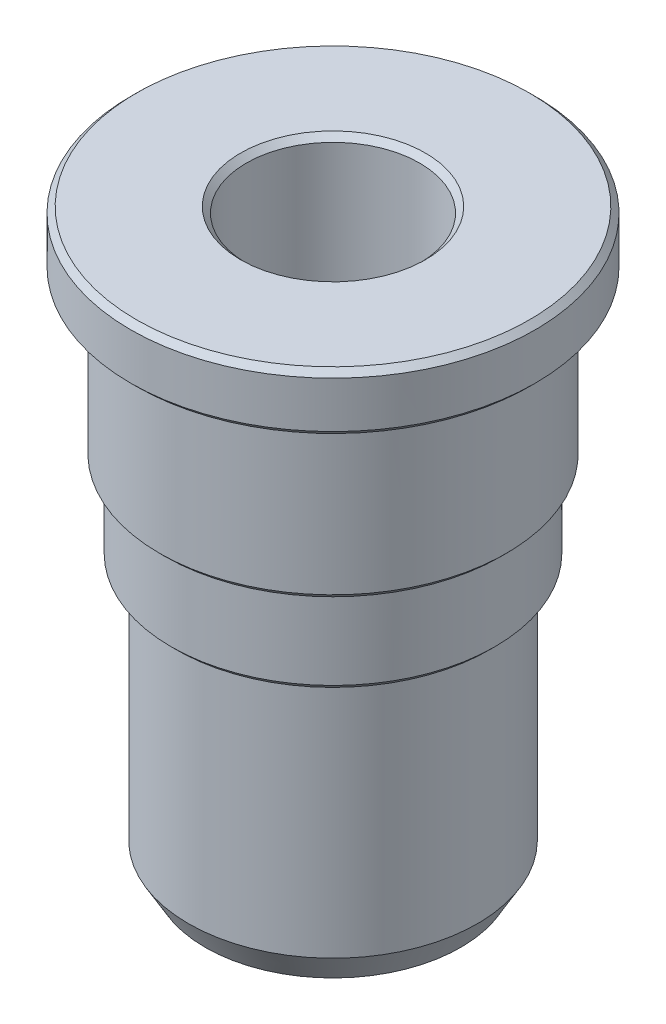
ISO-10303-21;
HEADER;
FILE_DESCRIPTION(('STEP AP214'),'2;1');
FILE_NAME('part.step','',(''),(''),'','','');
FILE_SCHEMA(('AUTOMOTIVE_DESIGN { 1 0 10303 214 1 1 1 1 }'));
ENDSEC;
DATA;
#1=APPLICATION_CONTEXT('core data for automotive mechanical design processes');
#2=APPLICATION_PROTOCOL_DEFINITION('international standard','automotive_design',2000,#1);
#3=PRODUCT_CONTEXT('',#1,'mechanical');
#4=PRODUCT('Part','Part','',(#3));
#5=PRODUCT_RELATED_PRODUCT_CATEGORY('part','',(#4));
#6=PRODUCT_DEFINITION_FORMATION('','',#4);
#7=PRODUCT_DEFINITION_CONTEXT('part definition',#1,'design');
#8=PRODUCT_DEFINITION('design','',#6,#7);
#9=PRODUCT_DEFINITION_SHAPE('','',#8);
#10=(LENGTH_UNIT() NAMED_UNIT(*) SI_UNIT(.MILLI.,.METRE.));
#11=(NAMED_UNIT(*) PLANE_ANGLE_UNIT() SI_UNIT($,.RADIAN.));
#12=(NAMED_UNIT(*) SI_UNIT($,.STERADIAN.) SOLID_ANGLE_UNIT());
#13=UNCERTAINTY_MEASURE_WITH_UNIT(LENGTH_MEASURE(1.E-05),#10,'distance_accuracy_value','');
#14=(GEOMETRIC_REPRESENTATION_CONTEXT(3) GLOBAL_UNCERTAINTY_ASSIGNED_CONTEXT((#13)) GLOBAL_UNIT_ASSIGNED_CONTEXT((#10,
#11,#12)) REPRESENTATION_CONTEXT('',''));
#15=CARTESIAN_POINT('',(0.,0.,0.));
#16=DIRECTION('',(0.,0.,1.));
#17=DIRECTION('',(1.,0.,0.));
#18=AXIS2_PLACEMENT_3D('',#15,#16,#17);
#19=CARTESIAN_POINT('',(-22.1132486540518,-70.0980202949079,0.));
#20=DIRECTION('',(0.,-1.,0.));
#21=DIRECTION('',(0.,0.,-1.));
#22=AXIS2_PLACEMENT_3D('',#19,#20,#21);
#23=PLANE('',#22);
#24=CARTESIAN_POINT('',(0.,-70.0980202949079,0.));
#25=DIRECTION('',(0.,-1.,0.));
#26=DIRECTION('',(0.,0.,-1.));
#27=AXIS2_PLACEMENT_3D('',#24,#25,#26);
#28=CIRCLE('',#27,16.);
#29=CARTESIAN_POINT('',(0.,-70.0980202949079,-16.));
#30=VERTEX_POINT('',#29);
#31=EDGE_CURVE('E10',#30,#30,#28,.F.);
#32=ORIENTED_EDGE('',*,*,#31,.T.);
#33=EDGE_LOOP('',(#32));
#34=FACE_BOUND('',#33,.T.);
#35=CARTESIAN_POINT('',(0.,-70.0980202949079,0.));
#36=DIRECTION('',(0.,1.,0.));
#37=DIRECTION('',(0.,0.,1.));
#38=AXIS2_PLACEMENT_3D('',#35,#36,#37);
#39=CIRCLE('',#38,22.1132486540518);
#40=CARTESIAN_POINT('',(0.,-70.0980202949079,22.1132486540518));
#41=VERTEX_POINT('',#40);
#42=EDGE_CURVE('E86',#41,#41,#39,.T.);
#43=ORIENTED_EDGE('',*,*,#42,.F.);
#44=EDGE_LOOP('',(#43));
#45=FACE_BOUND('',#44,.T.);
#46=ADVANCED_FACE('F30',(#34,#45),#23,.T.);
#47=CARTESIAN_POINT('',(0.,34.9453525641026,0.));
#48=DIRECTION('',(0.,1.,0.));
#49=DIRECTION('',(0.,0.,1.));
#50=AXIS2_PLACEMENT_3D('',#47,#48,#49);
#51=CYLINDRICAL_SURFACE('',#50,15.);
#52=CARTESIAN_POINT('',(0.,28.9019797050922,0.));
#53=DIRECTION('',(0.,1.,0.));
#54=DIRECTION('',(0.,0.,1.));
#55=AXIS2_PLACEMENT_3D('',#52,#53,#54);
#56=CIRCLE('',#55,15.);
#57=CARTESIAN_POINT('',(0.,28.9019797050922,15.));
#58=VERTEX_POINT('',#57);
#59=EDGE_CURVE('E68',#58,#58,#56,.T.);
#60=ORIENTED_EDGE('',*,*,#59,.T.);
#61=EDGE_LOOP('',(#60));
#62=FACE_BOUND('',#61,.T.);
#63=CARTESIAN_POINT('',(0.,-69.0980202949079,0.));
#64=DIRECTION('',(0.,-1.,0.));
#65=DIRECTION('',(0.,0.,-1.));
#66=AXIS2_PLACEMENT_3D('',#63,#64,#65);
#67=CIRCLE('',#66,15.);
#68=CARTESIAN_POINT('',(0.,-69.0980202949079,-15.));
#69=VERTEX_POINT('',#68);
#70=EDGE_CURVE('E71',#69,#69,#67,.T.);
#71=ORIENTED_EDGE('',*,*,#70,.T.);
#72=EDGE_LOOP('',(#71));
#73=FACE_BOUND('',#72,.T.);
#74=ADVANCED_FACE('F94',(#62,#73),#51,.F.);
#75=CARTESIAN_POINT('',(-15.,29.9019797050921,0.));
#76=DIRECTION('',(0.,1.,0.));
#77=DIRECTION('',(0.,0.,1.));
#78=AXIS2_PLACEMENT_3D('',#75,#76,#77);
#79=PLANE('',#78);
#80=CARTESIAN_POINT('',(0.,29.9019797050921,0.));
#81=DIRECTION('',(0.,1.,0.));
#82=DIRECTION('',(0.,0.,1.));
#83=AXIS2_PLACEMENT_3D('',#80,#81,#82);
#84=CIRCLE('',#83,16.);
#85=CARTESIAN_POINT('',(0.,29.9019797050921,16.));
#86=VERTEX_POINT('',#85);
#87=EDGE_CURVE('E62',#86,#86,#84,.F.);
#88=ORIENTED_EDGE('',*,*,#87,.T.);
#89=EDGE_LOOP('',(#88));
#90=FACE_BOUND('',#89,.T.);
#91=CARTESIAN_POINT('',(0.,29.9019797050921,0.));
#92=DIRECTION('',(0.,1.,0.));
#93=DIRECTION('',(0.,0.,1.));
#94=AXIS2_PLACEMENT_3D('',#91,#92,#93);
#95=CIRCLE('',#94,34.);
#96=CARTESIAN_POINT('',(0.,29.9019797050921,34.));
#97=VERTEX_POINT('',#96);
#98=EDGE_CURVE('E65',#97,#97,#95,.T.);
#99=ORIENTED_EDGE('',*,*,#98,.T.);
#100=EDGE_LOOP('',(#99));
#101=FACE_BOUND('',#100,.T.);
#102=ADVANCED_FACE('F99',(#90,#101),#79,.T.);
#103=CARTESIAN_POINT('',(0.,34.9453525641026,0.));
#104=DIRECTION('',(0.,1.,0.));
#105=DIRECTION('',(0.,0.,1.));
#106=AXIS2_PLACEMENT_3D('',#103,#104,#105);
#107=CYLINDRICAL_SURFACE('',#106,35.);
#108=CARTESIAN_POINT('',(0.,28.9019797050922,0.));
#109=DIRECTION('',(0.,1.,0.));
#110=DIRECTION('',(0.,0.,1.));
#111=AXIS2_PLACEMENT_3D('',#108,#109,#110);
#112=CIRCLE('',#111,35.);
#113=CARTESIAN_POINT('',(0.,28.9019797050922,35.));
#114=VERTEX_POINT('',#113);
#115=EDGE_CURVE('E56',#114,#114,#112,.F.);
#116=ORIENTED_EDGE('',*,*,#115,.T.);
#117=EDGE_LOOP('',(#116));
#118=FACE_BOUND('',#117,.T.);
#119=CARTESIAN_POINT('',(0.,20.9019797050922,0.));
#120=DIRECTION('',(0.,-1.,0.));
#121=DIRECTION('',(0.,0.,-1.));
#122=AXIS2_PLACEMENT_3D('',#119,#120,#121);
#123=CIRCLE('',#122,35.);
#124=CARTESIAN_POINT('',(0.,20.9019797050922,-35.));
#125=VERTEX_POINT('',#124);
#126=EDGE_CURVE('E59',#125,#125,#123,.F.);
#127=ORIENTED_EDGE('',*,*,#126,.T.);
#128=EDGE_LOOP('',(#127));
#129=FACE_BOUND('',#128,.T.);
#130=ADVANCED_FACE('F138',(#118,#129),#107,.T.);
#131=CARTESIAN_POINT('',(-35.,19.9019797050921,0.));
#132=DIRECTION('',(0.,-1.,0.));
#133=DIRECTION('',(0.,0.,-1.));
#134=AXIS2_PLACEMENT_3D('',#131,#132,#133);
#135=PLANE('',#134);
#136=CARTESIAN_POINT('',(0.,19.9019797050921,0.));
#137=DIRECTION('',(0.,-1.,0.));
#138=DIRECTION('',(0.,0.,-1.));
#139=AXIS2_PLACEMENT_3D('',#136,#137,#138);
#140=CIRCLE('',#139,34.);
#141=CARTESIAN_POINT('',(0.,19.9019797050921,-34.));
#142=VERTEX_POINT('',#141);
#143=EDGE_CURVE('E53',#142,#142,#140,.T.);
#144=ORIENTED_EDGE('',*,*,#143,.T.);
#145=EDGE_LOOP('',(#144));
#146=FACE_BOUND('',#145,.T.);
#147=CARTESIAN_POINT('',(0.,19.9019797050921,0.));
#148=DIRECTION('',(0.,1.,0.));
#149=DIRECTION('',(0.,0.,1.));
#150=AXIS2_PLACEMENT_3D('',#147,#148,#149);
#151=CIRCLE('',#150,30.);
#152=CARTESIAN_POINT('',(0.,19.9019797050921,30.));
#153=VERTEX_POINT('',#152);
#154=EDGE_CURVE('E74',#153,#153,#151,.T.);
#155=ORIENTED_EDGE('',*,*,#154,.T.);
#156=EDGE_LOOP('',(#155));
#157=FACE_BOUND('',#156,.T.);
#158=ADVANCED_FACE('F133',(#146,#157),#135,.T.);
#159=CARTESIAN_POINT('',(0.,34.9453525641026,0.));
#160=DIRECTION('',(0.,1.,0.));
#161=DIRECTION('',(0.,0.,1.));
#162=AXIS2_PLACEMENT_3D('',#159,#160,#161);
#163=CYLINDRICAL_SURFACE('',#162,30.);
#164=CARTESIAN_POINT('',(0.,-7.09802029490788,0.));
#165=DIRECTION('',(0.,-1.,0.));
#166=DIRECTION('',(0.,0.,-1.));
#167=AXIS2_PLACEMENT_3D('',#164,#165,#166);
#168=CIRCLE('',#167,30.);
#169=CARTESIAN_POINT('',(0.,-7.09802029490788,-30.));
#170=VERTEX_POINT('',#169);
#171=EDGE_CURVE('E41',#170,#170,#168,.F.);
#172=ORIENTED_EDGE('',*,*,#171,.T.);
#173=EDGE_LOOP('',(#172));
#174=FACE_BOUND('',#173,.T.);
#175=ORIENTED_EDGE('',*,*,#154,.F.);
#176=EDGE_LOOP('',(#175));
#177=FACE_BOUND('',#176,.T.);
#178=ADVANCED_FACE('F129',(#174,#177),#163,.T.);
#179=CARTESIAN_POINT('',(-30.,-8.09802029490786,0.));
#180=DIRECTION('',(0.,-1.,0.));
#181=DIRECTION('',(0.,0.,-1.));
#182=AXIS2_PLACEMENT_3D('',#179,#180,#181);
#183=PLANE('',#182);
#184=CARTESIAN_POINT('',(0.,-8.09802029490786,0.));
#185=DIRECTION('',(0.,-1.,0.));
#186=DIRECTION('',(0.,0.,-1.));
#187=AXIS2_PLACEMENT_3D('',#184,#185,#186);
#188=CIRCLE('',#187,29.);
#189=CARTESIAN_POINT('',(0.,-8.09802029490786,-29.));
#190=VERTEX_POINT('',#189);
#191=EDGE_CURVE('E37',#190,#190,#188,.T.);
#192=ORIENTED_EDGE('',*,*,#191,.T.);
#193=EDGE_LOOP('',(#192));
#194=FACE_BOUND('',#193,.T.);
#195=CARTESIAN_POINT('',(0.,-8.09802029490786,0.));
#196=DIRECTION('',(0.,1.,0.));
#197=DIRECTION('',(0.,0.,1.));
#198=AXIS2_PLACEMENT_3D('',#195,#196,#197);
#199=CIRCLE('',#198,28.);
#200=CARTESIAN_POINT('',(0.,-8.09802029490786,28.));
#201=VERTEX_POINT('',#200);
#202=EDGE_CURVE('E77',#201,#201,#199,.T.);
#203=ORIENTED_EDGE('',*,*,#202,.T.);
#204=EDGE_LOOP('',(#203));
#205=FACE_BOUND('',#204,.T.);
#206=ADVANCED_FACE('F132',(#194,#205),#183,.T.);
#207=CARTESIAN_POINT('',(0.,34.9453525641026,0.));
#208=DIRECTION('',(0.,1.,0.));
#209=DIRECTION('',(0.,0.,1.));
#210=AXIS2_PLACEMENT_3D('',#207,#208,#209);
#211=CYLINDRICAL_SURFACE('',#210,28.);
#212=CARTESIAN_POINT('',(0.,-22.0980202949079,0.));
#213=DIRECTION('',(0.,-1.,0.));
#214=DIRECTION('',(0.,0.,-1.));
#215=AXIS2_PLACEMENT_3D('',#212,#213,#214);
#216=CIRCLE('',#215,28.);
#217=CARTESIAN_POINT('',(0.,-22.0980202949079,-28.));
#218=VERTEX_POINT('',#217);
#219=EDGE_CURVE('E50',#218,#218,#216,.F.);
#220=ORIENTED_EDGE('',*,*,#219,.T.);
#221=EDGE_LOOP('',(#220));
#222=FACE_BOUND('',#221,.T.);
#223=ORIENTED_EDGE('',*,*,#202,.F.);
#224=EDGE_LOOP('',(#223));
#225=FACE_BOUND('',#224,.T.);
#226=ADVANCED_FACE('F185',(#222,#225),#211,.T.);
#227=CARTESIAN_POINT('',(-28.,-23.0980202949079,0.));
#228=DIRECTION('',(0.,-1.,0.));
#229=DIRECTION('',(0.,0.,-1.));
#230=AXIS2_PLACEMENT_3D('',#227,#228,#229);
#231=PLANE('',#230);
#232=CARTESIAN_POINT('',(0.,-23.0980202949079,0.));
#233=DIRECTION('',(0.,-1.,0.));
#234=DIRECTION('',(0.,0.,-1.));
#235=AXIS2_PLACEMENT_3D('',#232,#233,#234);
#236=CIRCLE('',#235,27.);
#237=CARTESIAN_POINT('',(0.,-23.0980202949079,-27.));
#238=VERTEX_POINT('',#237);
#239=EDGE_CURVE('E45',#238,#238,#236,.T.);
#240=ORIENTED_EDGE('',*,*,#239,.T.);
#241=EDGE_LOOP('',(#240));
#242=FACE_BOUND('',#241,.T.);
#243=CARTESIAN_POINT('',(0.,-23.0980202949079,0.));
#244=DIRECTION('',(0.,1.,0.));
#245=DIRECTION('',(0.,0.,1.));
#246=AXIS2_PLACEMENT_3D('',#243,#244,#245);
#247=CIRCLE('',#246,25.);
#248=CARTESIAN_POINT('',(0.,-23.0980202949079,25.));
#249=VERTEX_POINT('',#248);
#250=EDGE_CURVE('E80',#249,#249,#247,.T.);
#251=ORIENTED_EDGE('',*,*,#250,.T.);
#252=EDGE_LOOP('',(#251));
#253=FACE_BOUND('',#252,.T.);
#254=ADVANCED_FACE('F193',(#242,#253),#231,.T.);
#255=CARTESIAN_POINT('',(0.,34.9453525641026,0.));
#256=DIRECTION('',(0.,1.,0.));
#257=DIRECTION('',(0.,0.,1.));
#258=AXIS2_PLACEMENT_3D('',#255,#256,#257);
#259=CYLINDRICAL_SURFACE('',#258,25.);
#260=CARTESIAN_POINT('',(0.,-65.0980202949079,0.));
#261=DIRECTION('',(0.,1.,0.));
#262=DIRECTION('',(0.,0.,1.));
#263=AXIS2_PLACEMENT_3D('',#260,#261,#262);
#264=CIRCLE('',#263,25.);
#265=CARTESIAN_POINT('',(0.,-65.0980202949079,25.));
#266=VERTEX_POINT('',#265);
#267=EDGE_CURVE('E83',#266,#266,#264,.T.);
#268=ORIENTED_EDGE('',*,*,#267,.T.);
#269=EDGE_LOOP('',(#268));
#270=FACE_BOUND('',#269,.T.);
#271=ORIENTED_EDGE('',*,*,#250,.F.);
#272=EDGE_LOOP('',(#271));
#273=FACE_BOUND('',#272,.T.);
#274=ADVANCED_FACE('F203',(#270,#273),#259,.T.);
#275=CARTESIAN_POINT('',(0.,-65.0980202949079,0.));
#276=DIRECTION('',(0.,1.,0.));
#277=DIRECTION('',(0.,0.,1.));
#278=AXIS2_PLACEMENT_3D('',#275,#276,#277);
#279=CONICAL_SURFACE('',#278,25.,0.5235987755983);
#280=ORIENTED_EDGE('',*,*,#42,.T.);
#281=EDGE_LOOP('',(#280));
#282=FACE_BOUND('',#281,.T.);
#283=ORIENTED_EDGE('',*,*,#267,.F.);
#284=EDGE_LOOP('',(#283));
#285=FACE_BOUND('',#284,.T.);
#286=ADVANCED_FACE('F90',(#282,#285),#279,.T.);
#287=CARTESIAN_POINT('',(0.,28.9019797050922,0.));
#288=DIRECTION('',(0.,1.,0.));
#289=DIRECTION('',(0.,0.,1.));
#290=AXIS2_PLACEMENT_3D('',#287,#288,#289);
#291=CONICAL_SURFACE('',#290,15.,0.785398163397444);
#292=ORIENTED_EDGE('',*,*,#87,.F.);
#293=EDGE_LOOP('',(#292));
#294=FACE_BOUND('',#293,.T.);
#295=ORIENTED_EDGE('',*,*,#59,.F.);
#296=EDGE_LOOP('',(#295));
#297=FACE_BOUND('',#296,.T.);
#298=ADVANCED_FACE('F104',(#294,#297),#291,.F.);
#299=CARTESIAN_POINT('',(0.,29.9019797050921,0.));
#300=DIRECTION('',(0.,-1.,0.));
#301=DIRECTION('',(0.,0.,-1.));
#302=AXIS2_PLACEMENT_3D('',#299,#300,#301);
#303=CONICAL_SURFACE('',#302,34.,0.785398163397452);
#304=ORIENTED_EDGE('',*,*,#115,.F.);
#305=EDGE_LOOP('',(#304));
#306=FACE_BOUND('',#305,.T.);
#307=ORIENTED_EDGE('',*,*,#98,.F.);
#308=EDGE_LOOP('',(#307));
#309=FACE_BOUND('',#308,.T.);
#310=ADVANCED_FACE('F107',(#306,#309),#303,.T.);
#311=CARTESIAN_POINT('',(0.,20.9019797050922,0.));
#312=DIRECTION('',(0.,1.,0.));
#313=DIRECTION('',(0.,0.,1.));
#314=AXIS2_PLACEMENT_3D('',#311,#312,#313);
#315=CONICAL_SURFACE('',#314,35.,0.785398163397452);
#316=ORIENTED_EDGE('',*,*,#143,.F.);
#317=EDGE_LOOP('',(#316));
#318=FACE_BOUND('',#317,.T.);
#319=ORIENTED_EDGE('',*,*,#126,.F.);
#320=EDGE_LOOP('',(#319));
#321=FACE_BOUND('',#320,.T.);
#322=ADVANCED_FACE('F111',(#318,#321),#315,.T.);
#323=CARTESIAN_POINT('',(0.,-22.0980202949079,0.));
#324=DIRECTION('',(0.,1.,0.));
#325=DIRECTION('',(0.,0.,1.));
#326=AXIS2_PLACEMENT_3D('',#323,#324,#325);
#327=CONICAL_SURFACE('',#326,28.,0.785398163397445);
#328=ORIENTED_EDGE('',*,*,#239,.F.);
#329=EDGE_LOOP('',(#328));
#330=FACE_BOUND('',#329,.T.);
#331=ORIENTED_EDGE('',*,*,#219,.F.);
#332=EDGE_LOOP('',(#331));
#333=FACE_BOUND('',#332,.T.);
#334=ADVANCED_FACE('F115',(#330,#333),#327,.T.);
#335=CARTESIAN_POINT('',(0.,-7.09802029490788,0.));
#336=DIRECTION('',(0.,1.,0.));
#337=DIRECTION('',(0.,0.,1.));
#338=AXIS2_PLACEMENT_3D('',#335,#336,#337);
#339=CONICAL_SURFACE('',#338,30.,0.785398163397448);
#340=ORIENTED_EDGE('',*,*,#191,.F.);
#341=EDGE_LOOP('',(#340));
#342=FACE_BOUND('',#341,.T.);
#343=ORIENTED_EDGE('',*,*,#171,.F.);
#344=EDGE_LOOP('',(#343));
#345=FACE_BOUND('',#344,.T.);
#346=ADVANCED_FACE('F118',(#342,#345),#339,.T.);
#347=CARTESIAN_POINT('',(0.,-70.0980202949079,0.));
#348=DIRECTION('',(0.,-1.,0.));
#349=DIRECTION('',(0.,0.,-1.));
#350=AXIS2_PLACEMENT_3D('',#347,#348,#349);
#351=CONICAL_SURFACE('',#350,16.,0.785398163397447);
#352=ORIENTED_EDGE('',*,*,#70,.F.);
#353=EDGE_LOOP('',(#352));
#354=FACE_BOUND('',#353,.T.);
#355=ORIENTED_EDGE('',*,*,#31,.F.);
#356=EDGE_LOOP('',(#355));
#357=FACE_BOUND('',#356,.T.);
#358=ADVANCED_FACE('F32',(#354,#357),#351,.F.);
#359=CLOSED_SHELL('',(#46,#74,#102,#130,#158,#178,#206,#226,#254,#274,#286,#298,#310,#322,#334,
#346,#358));
#360=MANIFOLD_SOLID_BREP('B2',#359);
#361=ADVANCED_BREP_SHAPE_REPRESENTATION('',(#18,#360),#14);
#362=SHAPE_DEFINITION_REPRESENTATION(#9,#361);
ENDSEC;
END-ISO-10303-21;
